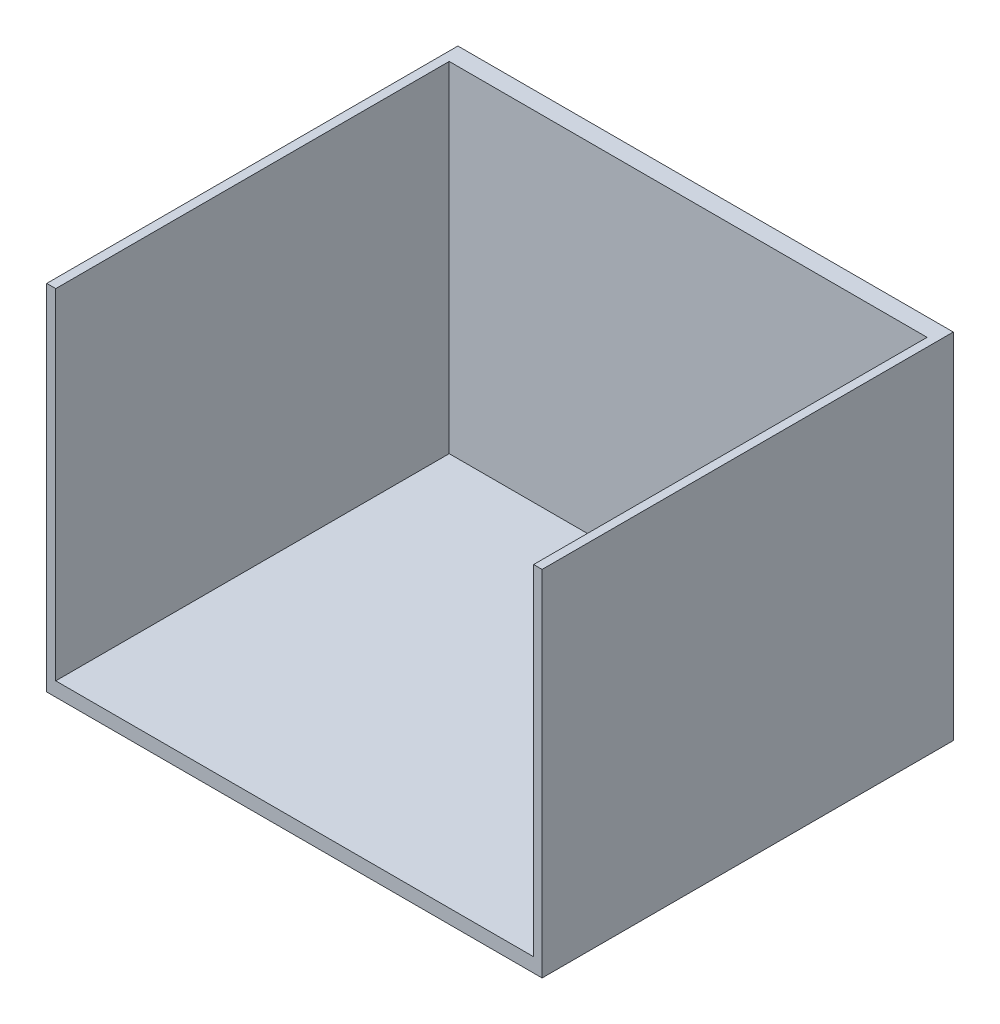
ISO-10303-21;
HEADER;
FILE_DESCRIPTION(('STEP AP214'),'2;1');
FILE_NAME('part.step','',(''),(''),'','','');
FILE_SCHEMA(('AUTOMOTIVE_DESIGN { 1 0 10303 214 1 1 1 1 }'));
ENDSEC;
DATA;
#1=APPLICATION_CONTEXT('core data for automotive mechanical design processes');
#2=APPLICATION_PROTOCOL_DEFINITION('international standard','automotive_design',2000,#1);
#3=PRODUCT_CONTEXT('',#1,'mechanical');
#4=PRODUCT('Part','Part','',(#3));
#5=PRODUCT_RELATED_PRODUCT_CATEGORY('part','',(#4));
#6=PRODUCT_DEFINITION_FORMATION('','',#4);
#7=PRODUCT_DEFINITION_CONTEXT('part definition',#1,'design');
#8=PRODUCT_DEFINITION('design','',#6,#7);
#9=PRODUCT_DEFINITION_SHAPE('','',#8);
#10=(LENGTH_UNIT() NAMED_UNIT(*) SI_UNIT(.MILLI.,.METRE.));
#11=(NAMED_UNIT(*) PLANE_ANGLE_UNIT() SI_UNIT($,.RADIAN.));
#12=(NAMED_UNIT(*) SI_UNIT($,.STERADIAN.) SOLID_ANGLE_UNIT());
#13=UNCERTAINTY_MEASURE_WITH_UNIT(LENGTH_MEASURE(1.E-05),#10,'distance_accuracy_value','');
#14=(GEOMETRIC_REPRESENTATION_CONTEXT(3) GLOBAL_UNCERTAINTY_ASSIGNED_CONTEXT((#13)) GLOBAL_UNIT_ASSIGNED_CONTEXT((#10,
#11,#12)) REPRESENTATION_CONTEXT('',''));
#15=CARTESIAN_POINT('',(0.,0.,0.));
#16=DIRECTION('',(0.,0.,1.));
#17=DIRECTION('',(1.,0.,0.));
#18=AXIS2_PLACEMENT_3D('',#15,#16,#17);
#19=CARTESIAN_POINT('',(0.,0.,3.175));
#20=DIRECTION('',(0.,0.,1.));
#21=DIRECTION('',(1.,0.,0.));
#22=AXIS2_PLACEMENT_3D('',#19,#20,#21);
#23=PLANE('',#22);
#24=DIRECTION('',(-1.,0.,0.));
#25=VECTOR('',#24,1.);
#26=CARTESIAN_POINT('',(0.,-44.2453305785124,3.175));
#27=LINE('',#26,#25);
#28=CARTESIAN_POINT('',(54.6813719008264,-44.2453305785124,3.175));
#29=VERTEX_POINT('',#28);
#30=CARTESIAN_POINT('',(-31.0768733400835,-44.2453305785124,3.175));
#31=VERTEX_POINT('',#30);
#32=EDGE_CURVE('E118',#29,#31,#27,.T.);
#33=ORIENTED_EDGE('',*,*,#32,.F.);
#34=DIRECTION('',(0.,-1.,0.));
#35=VECTOR('',#34,1.);
#36=CARTESIAN_POINT('',(54.6813719008264,16.7146694214876,3.175));
#37=LINE('',#36,#35);
#38=CARTESIAN_POINT('',(54.6813719008264,16.7146694214876,3.175));
#39=VERTEX_POINT('',#38);
#40=EDGE_CURVE('E51',#39,#29,#37,.T.);
#41=ORIENTED_EDGE('',*,*,#40,.F.);
#42=DIRECTION('',(-1.,0.,0.));
#43=VECTOR('',#42,1.);
#44=CARTESIAN_POINT('',(-32.6946280991736,16.7146694214876,3.175));
#45=LINE('',#44,#43);
#46=CARTESIAN_POINT('',(-31.0768733400835,16.7146694214876,3.175));
#47=VERTEX_POINT('',#46);
#48=EDGE_CURVE('E147',#39,#47,#45,.T.);
#49=ORIENTED_EDGE('',*,*,#48,.T.);
#50=DIRECTION('',(0.,1.,0.));
#51=VECTOR('',#50,1.);
#52=CARTESIAN_POINT('',(-31.0768733400835,16.7146694214876,3.175));
#53=LINE('',#52,#51);
#54=EDGE_CURVE('E126',#31,#47,#53,.T.);
#55=ORIENTED_EDGE('',*,*,#54,.F.);
#56=EDGE_LOOP('',(#33,#41,#49,#55));
#57=FACE_BOUND('',#56,.T.);
#58=ADVANCED_FACE('F36',(#57),#23,.T.);
#59=CARTESIAN_POINT('',(-32.6946280991736,16.7146694214876,3.175));
#60=DIRECTION('',(1.,0.,0.));
#61=DIRECTION('',(0.,1.,0.));
#62=AXIS2_PLACEMENT_3D('',#59,#60,#61);
#63=PLANE('',#62);
#64=DIRECTION('',(0.,-1.,0.));
#65=VECTOR('',#64,1.);
#66=CARTESIAN_POINT('',(-32.6946280991736,16.7146694214876,0.));
#67=LINE('',#66,#65);
#68=CARTESIAN_POINT('',(-32.6946280991736,16.7146694214876,0.));
#69=VERTEX_POINT('',#68);
#70=CARTESIAN_POINT('',(-32.6946280991735,-46.7853305785124,0.));
#71=VERTEX_POINT('',#70);
#72=EDGE_CURVE('E146',#69,#71,#67,.T.);
#73=ORIENTED_EDGE('',*,*,#72,.T.);
#74=DIRECTION('',(0.,0.,-1.));
#75=VECTOR('',#74,1.);
#76=CARTESIAN_POINT('',(-32.6946280991735,-46.7853305785124,3.175));
#77=LINE('',#76,#75);
#78=CARTESIAN_POINT('',(-32.6946280991736,-46.7853305785124,73.787));
#79=VERTEX_POINT('',#78);
#80=EDGE_CURVE('E11',#79,#71,#77,.T.);
#81=ORIENTED_EDGE('',*,*,#80,.F.);
#82=DIRECTION('',(0.,-1.,0.));
#83=VECTOR('',#82,1.);
#84=CARTESIAN_POINT('',(-32.6946280991736,16.7146694214876,73.787));
#85=LINE('',#84,#83);
#86=CARTESIAN_POINT('',(-32.6946280991736,16.7146694214876,73.787));
#87=VERTEX_POINT('',#86);
#88=EDGE_CURVE('E133',#87,#79,#85,.T.);
#89=ORIENTED_EDGE('',*,*,#88,.F.);
#90=DIRECTION('',(0.,0.,-1.));
#91=VECTOR('',#90,1.);
#92=CARTESIAN_POINT('',(-32.6946280991736,16.7146694214876,3.175));
#93=LINE('',#92,#91);
#94=EDGE_CURVE('E149',#87,#69,#93,.T.);
#95=ORIENTED_EDGE('',*,*,#94,.T.);
#96=EDGE_LOOP('',(#73,#81,#89,#95));
#97=FACE_BOUND('',#96,.T.);
#98=ADVANCED_FACE('F38',(#97),#63,.F.);
#99=CARTESIAN_POINT('',(-32.6946280991735,-46.7853305785124,3.175));
#100=DIRECTION('',(0.,1.,0.));
#101=DIRECTION('',(0.,0.,1.));
#102=AXIS2_PLACEMENT_3D('',#99,#100,#101);
#103=PLANE('',#102);
#104=DIRECTION('',(1.,0.,0.));
#105=VECTOR('',#104,1.);
#106=CARTESIAN_POINT('',(-32.6946280991735,-46.7853305785124,0.));
#107=LINE('',#106,#105);
#108=CARTESIAN_POINT('',(56.2053719008264,-46.7853305785124,0.));
#109=VERTEX_POINT('',#108);
#110=EDGE_CURVE('E151',#71,#109,#107,.T.);
#111=ORIENTED_EDGE('',*,*,#110,.T.);
#112=DIRECTION('',(0.,0.,-1.));
#113=VECTOR('',#112,1.);
#114=CARTESIAN_POINT('',(56.2053719008264,-46.7853305785124,3.175));
#115=LINE('',#114,#113);
#116=CARTESIAN_POINT('',(56.2053719008264,-46.7853305785124,73.787));
#117=VERTEX_POINT('',#116);
#118=EDGE_CURVE('E44',#117,#109,#115,.T.);
#119=ORIENTED_EDGE('',*,*,#118,.F.);
#120=DIRECTION('',(1.,0.,0.));
#121=VECTOR('',#120,1.);
#122=CARTESIAN_POINT('',(-32.6946280991736,-46.7853305785124,73.787));
#123=LINE('',#122,#121);
#124=EDGE_CURVE('E135',#79,#117,#123,.T.);
#125=ORIENTED_EDGE('',*,*,#124,.F.);
#126=ORIENTED_EDGE('',*,*,#80,.T.);
#127=EDGE_LOOP('',(#111,#119,#125,#126));
#128=FACE_BOUND('',#127,.T.);
#129=ADVANCED_FACE('F182',(#128),#103,.F.);
#130=CARTESIAN_POINT('',(56.2053719008264,16.7146694214876,3.175));
#131=DIRECTION('',(-1.,0.,0.));
#132=DIRECTION('',(0.,-1.,0.));
#133=AXIS2_PLACEMENT_3D('',#130,#131,#132);
#134=PLANE('',#133);
#135=DIRECTION('',(0.,0.,-1.));
#136=VECTOR('',#135,1.);
#137=CARTESIAN_POINT('',(56.2053719008264,16.7146694214876,3.175));
#138=LINE('',#137,#136);
#139=CARTESIAN_POINT('',(56.2053719008264,16.7146694214876,73.787));
#140=VERTEX_POINT('',#139);
#141=CARTESIAN_POINT('',(56.2053719008264,16.7146694214876,0.));
#142=VERTEX_POINT('',#141);
#143=EDGE_CURVE('E157',#140,#142,#138,.T.);
#144=ORIENTED_EDGE('',*,*,#143,.F.);
#145=DIRECTION('',(0.,1.,0.));
#146=VECTOR('',#145,1.);
#147=CARTESIAN_POINT('',(56.2053719008264,16.7146694214876,73.787));
#148=LINE('',#147,#146);
#149=EDGE_CURVE('E128',#117,#140,#148,.T.);
#150=ORIENTED_EDGE('',*,*,#149,.F.);
#151=ORIENTED_EDGE('',*,*,#118,.T.);
#152=DIRECTION('',(0.,1.,0.));
#153=VECTOR('',#152,1.);
#154=CARTESIAN_POINT('',(56.2053719008264,16.7146694214876,0.));
#155=LINE('',#154,#153);
#156=EDGE_CURVE('E153',#109,#142,#155,.T.);
#157=ORIENTED_EDGE('',*,*,#156,.T.);
#158=EDGE_LOOP('',(#144,#150,#151,#157));
#159=FACE_BOUND('',#158,.T.);
#160=ADVANCED_FACE('F164',(#159),#134,.F.);
#161=CARTESIAN_POINT('',(-32.6946280991736,16.7146694214876,3.175));
#162=DIRECTION('',(0.,-1.,0.));
#163=DIRECTION('',(0.,0.,-1.));
#164=AXIS2_PLACEMENT_3D('',#161,#162,#163);
#165=PLANE('',#164);
#166=DIRECTION('',(-1.,0.,0.));
#167=VECTOR('',#166,1.);
#168=CARTESIAN_POINT('',(-32.6946280991736,16.7146694214876,0.));
#169=LINE('',#168,#167);
#170=EDGE_CURVE('E59',#142,#69,#169,.T.);
#171=ORIENTED_EDGE('',*,*,#170,.T.);
#172=ORIENTED_EDGE('',*,*,#94,.F.);
#173=DIRECTION('',(-1.,0.,0.));
#174=VECTOR('',#173,1.);
#175=CARTESIAN_POINT('',(-32.6946280991736,16.7146694214876,73.787));
#176=LINE('',#175,#174);
#177=CARTESIAN_POINT('',(-31.0768733400835,16.7146694214876,73.787));
#178=VERTEX_POINT('',#177);
#179=EDGE_CURVE('E139',#178,#87,#176,.T.);
#180=ORIENTED_EDGE('',*,*,#179,.F.);
#181=DIRECTION('',(0.,0.,-1.));
#182=VECTOR('',#181,1.);
#183=CARTESIAN_POINT('',(-31.0768733400835,16.7146694214876,73.787));
#184=LINE('',#183,#182);
#185=EDGE_CURVE('E142',#178,#47,#184,.T.);
#186=ORIENTED_EDGE('',*,*,#185,.T.);
#187=ORIENTED_EDGE('',*,*,#48,.F.);
#188=DIRECTION('',(0.,0.,-1.));
#189=VECTOR('',#188,1.);
#190=CARTESIAN_POINT('',(54.6813719008264,16.7146694214876,73.787));
#191=LINE('',#190,#189);
#192=CARTESIAN_POINT('',(54.6813719008264,16.7146694214876,73.787));
#193=VERTEX_POINT('',#192);
#194=EDGE_CURVE('E124',#193,#39,#191,.T.);
#195=ORIENTED_EDGE('',*,*,#194,.F.);
#196=DIRECTION('',(-1.,0.,0.));
#197=VECTOR('',#196,1.);
#198=CARTESIAN_POINT('',(56.2053719008264,16.7146694214876,73.787));
#199=LINE('',#198,#197);
#200=EDGE_CURVE('E122',#140,#193,#199,.T.);
#201=ORIENTED_EDGE('',*,*,#200,.F.);
#202=ORIENTED_EDGE('',*,*,#143,.T.);
#203=EDGE_LOOP('',(#171,#172,#180,#186,#187,#195,#201,#202));
#204=FACE_BOUND('',#203,.T.);
#205=ADVANCED_FACE('F175',(#204),#165,.F.);
#206=CARTESIAN_POINT('',(0.,0.,0.));
#207=DIRECTION('',(0.,0.,1.));
#208=DIRECTION('',(1.,0.,0.));
#209=AXIS2_PLACEMENT_3D('',#206,#207,#208);
#210=PLANE('',#209);
#211=ORIENTED_EDGE('',*,*,#170,.F.);
#212=ORIENTED_EDGE('',*,*,#156,.F.);
#213=ORIENTED_EDGE('',*,*,#110,.F.);
#214=ORIENTED_EDGE('',*,*,#72,.F.);
#215=EDGE_LOOP('',(#211,#212,#213,#214));
#216=FACE_BOUND('',#215,.T.);
#217=ADVANCED_FACE('F169',(#216),#210,.F.);
#218=CARTESIAN_POINT('',(-31.0768733400835,16.7146694214876,73.787));
#219=DIRECTION('',(-1.,0.,0.));
#220=DIRECTION('',(0.,0.,1.));
#221=AXIS2_PLACEMENT_3D('',#218,#219,#220);
#222=PLANE('',#221);
#223=DIRECTION('',(0.,1.,0.));
#224=VECTOR('',#223,1.);
#225=CARTESIAN_POINT('',(-31.0768733400835,16.7146694214876,73.787));
#226=LINE('',#225,#224);
#227=CARTESIAN_POINT('',(-31.0768733400835,-44.2453305785124,73.787));
#228=VERTEX_POINT('',#227);
#229=EDGE_CURVE('E137',#228,#178,#226,.T.);
#230=ORIENTED_EDGE('',*,*,#229,.F.);
#231=DIRECTION('',(0.,0.,-1.));
#232=VECTOR('',#231,1.);
#233=CARTESIAN_POINT('',(-31.0768733400835,-44.2453305785124,73.787));
#234=LINE('',#233,#232);
#235=EDGE_CURVE('E108',#228,#31,#234,.T.);
#236=ORIENTED_EDGE('',*,*,#235,.T.);
#237=ORIENTED_EDGE('',*,*,#54,.T.);
#238=ORIENTED_EDGE('',*,*,#185,.F.);
#239=EDGE_LOOP('',(#230,#236,#237,#238));
#240=FACE_BOUND('',#239,.T.);
#241=ADVANCED_FACE('F178',(#240),#222,.F.);
#242=CARTESIAN_POINT('',(0.,0.,73.787));
#243=DIRECTION('',(0.,0.,1.));
#244=DIRECTION('',(1.,0.,0.));
#245=AXIS2_PLACEMENT_3D('',#242,#243,#244);
#246=PLANE('',#245);
#247=ORIENTED_EDGE('',*,*,#88,.T.);
#248=ORIENTED_EDGE('',*,*,#124,.T.);
#249=ORIENTED_EDGE('',*,*,#149,.T.);
#250=ORIENTED_EDGE('',*,*,#200,.T.);
#251=DIRECTION('',(0.,-1.,0.));
#252=VECTOR('',#251,1.);
#253=CARTESIAN_POINT('',(54.6813719008264,16.7146694214876,73.787));
#254=LINE('',#253,#252);
#255=CARTESIAN_POINT('',(54.6813719008264,-44.2453305785124,73.787));
#256=VERTEX_POINT('',#255);
#257=EDGE_CURVE('E117',#193,#256,#254,.T.);
#258=ORIENTED_EDGE('',*,*,#257,.T.);
#259=DIRECTION('',(-1.,0.,0.));
#260=VECTOR('',#259,1.);
#261=CARTESIAN_POINT('',(-32.6946280991735,-44.2453305785124,73.787));
#262=LINE('',#261,#260);
#263=EDGE_CURVE('E103',#256,#228,#262,.T.);
#264=ORIENTED_EDGE('',*,*,#263,.T.);
#265=ORIENTED_EDGE('',*,*,#229,.T.);
#266=ORIENTED_EDGE('',*,*,#179,.T.);
#267=EDGE_LOOP('',(#247,#248,#249,#250,#258,#264,#265,#266));
#268=FACE_BOUND('',#267,.T.);
#269=ADVANCED_FACE('F120',(#268),#246,.T.);
#270=CARTESIAN_POINT('',(54.6813719008264,16.7146694214876,73.787));
#271=DIRECTION('',(1.,0.,0.));
#272=DIRECTION('',(0.,1.,0.));
#273=AXIS2_PLACEMENT_3D('',#270,#271,#272);
#274=PLANE('',#273);
#275=ORIENTED_EDGE('',*,*,#40,.T.);
#276=DIRECTION('',(0.,0.,1.));
#277=VECTOR('',#276,1.);
#278=CARTESIAN_POINT('',(54.6813719008264,-44.2453305785124,73.787));
#279=LINE('',#278,#277);
#280=EDGE_CURVE('E106',#29,#256,#279,.T.);
#281=ORIENTED_EDGE('',*,*,#280,.T.);
#282=ORIENTED_EDGE('',*,*,#257,.F.);
#283=ORIENTED_EDGE('',*,*,#194,.T.);
#284=EDGE_LOOP('',(#275,#281,#282,#283));
#285=FACE_BOUND('',#284,.T.);
#286=ADVANCED_FACE('F115',(#285),#274,.F.);
#287=CARTESIAN_POINT('',(0.,-44.2453305785124,0.));
#288=DIRECTION('',(0.,1.,0.));
#289=DIRECTION('',(0.,0.,1.));
#290=AXIS2_PLACEMENT_3D('',#287,#288,#289);
#291=PLANE('',#290);
#292=ORIENTED_EDGE('',*,*,#235,.F.);
#293=ORIENTED_EDGE('',*,*,#263,.F.);
#294=ORIENTED_EDGE('',*,*,#280,.F.);
#295=ORIENTED_EDGE('',*,*,#32,.T.);
#296=EDGE_LOOP('',(#292,#293,#294,#295));
#297=FACE_BOUND('',#296,.T.);
#298=ADVANCED_FACE('F105',(#297),#291,.T.);
#299=CLOSED_SHELL('',(#58,#98,#129,#160,#205,#217,#241,#269,#286,#298));
#300=MANIFOLD_SOLID_BREP('B2',#299);
#301=ADVANCED_BREP_SHAPE_REPRESENTATION('',(#18,#300),#14);
#302=SHAPE_DEFINITION_REPRESENTATION(#9,#301);
ENDSEC;
END-ISO-10303-21;
